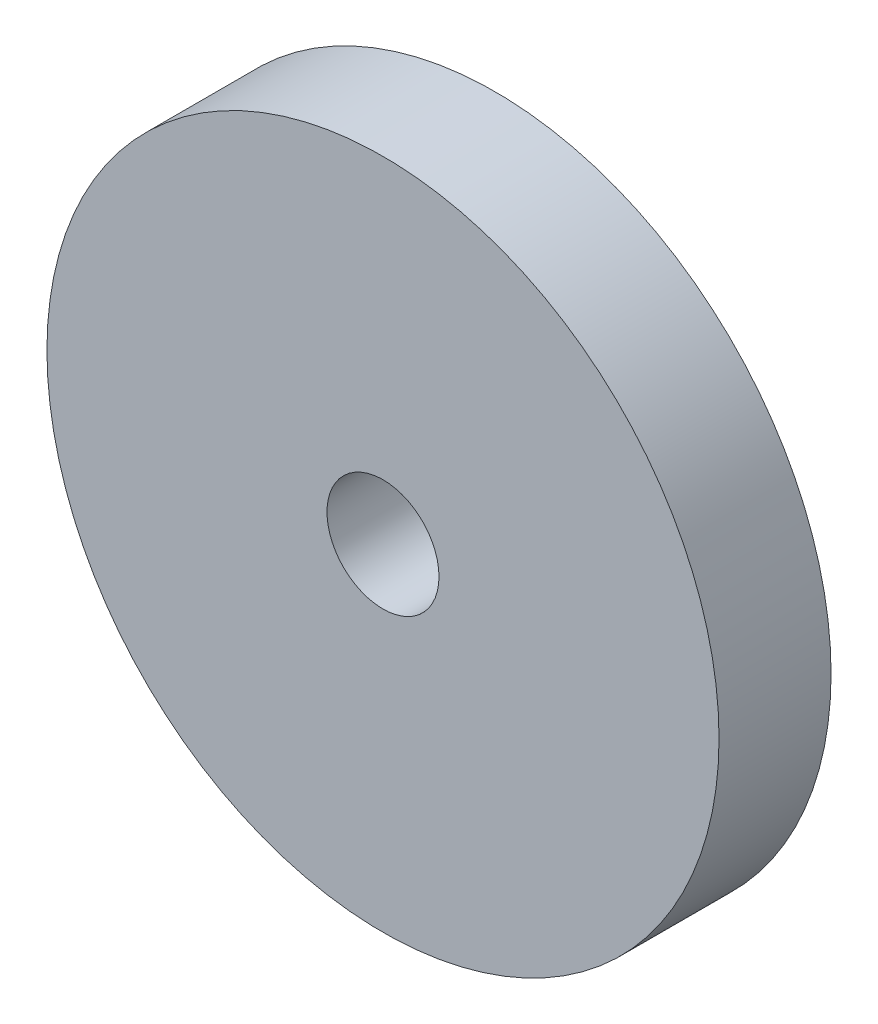
ISO-10303-21;
HEADER;
FILE_DESCRIPTION(('STEP AP214'),'2;1');
FILE_NAME('part.step','',(''),(''),'','','');
FILE_SCHEMA(('AUTOMOTIVE_DESIGN { 1 0 10303 214 1 1 1 1 }'));
ENDSEC;
DATA;
#1=APPLICATION_CONTEXT('core data for automotive mechanical design processes');
#2=APPLICATION_PROTOCOL_DEFINITION('international standard','automotive_design',2000,#1);
#3=PRODUCT_CONTEXT('',#1,'mechanical');
#4=PRODUCT('Part','Part','',(#3));
#5=PRODUCT_RELATED_PRODUCT_CATEGORY('part','',(#4));
#6=PRODUCT_DEFINITION_FORMATION('','',#4);
#7=PRODUCT_DEFINITION_CONTEXT('part definition',#1,'design');
#8=PRODUCT_DEFINITION('design','',#6,#7);
#9=PRODUCT_DEFINITION_SHAPE('','',#8);
#10=(LENGTH_UNIT() NAMED_UNIT(*) SI_UNIT(.MILLI.,.METRE.));
#11=(NAMED_UNIT(*) PLANE_ANGLE_UNIT() SI_UNIT($,.RADIAN.));
#12=(NAMED_UNIT(*) SI_UNIT($,.STERADIAN.) SOLID_ANGLE_UNIT());
#13=UNCERTAINTY_MEASURE_WITH_UNIT(LENGTH_MEASURE(1.E-05),#10,'distance_accuracy_value','');
#14=(GEOMETRIC_REPRESENTATION_CONTEXT(3) GLOBAL_UNCERTAINTY_ASSIGNED_CONTEXT((#13)) GLOBAL_UNIT_ASSIGNED_CONTEXT((#10,
#11,#12)) REPRESENTATION_CONTEXT('',''));
#15=CARTESIAN_POINT('',(0.,0.,0.));
#16=DIRECTION('',(0.,0.,1.));
#17=DIRECTION('',(1.,0.,0.));
#18=AXIS2_PLACEMENT_3D('',#15,#16,#17);
#19=CARTESIAN_POINT('',(18.5642751067,286.9748211934,3.));
#20=DIRECTION('',(0.,0.,1.));
#21=DIRECTION('',(1.,0.,0.));
#22=AXIS2_PLACEMENT_3D('',#19,#20,#21);
#23=PLANE('',#22);
#24=CARTESIAN_POINT('',(18.5642751067,286.9748211934,3.));
#25=DIRECTION('',(0.,0.,1.));
#26=DIRECTION('',(1.,0.,0.));
#27=AXIS2_PLACEMENT_3D('',#24,#25,#26);
#28=CIRCLE('',#27,9.00000000000001);
#29=CARTESIAN_POINT('',(27.5642751067,286.9748211934,3.));
#30=VERTEX_POINT('',#29);
#31=EDGE_CURVE('E10',#30,#30,#28,.T.);
#32=ORIENTED_EDGE('',*,*,#31,.T.);
#33=EDGE_LOOP('',(#32));
#34=FACE_BOUND('',#33,.T.);
#35=CARTESIAN_POINT('',(18.5642751067,286.9748211934,3.));
#36=DIRECTION('',(0.,0.,1.));
#37=DIRECTION('',(1.,0.,0.));
#38=AXIS2_PLACEMENT_3D('',#35,#36,#37);
#39=CIRCLE('',#38,1.5);
#40=CARTESIAN_POINT('',(20.0642751067,286.9748211934,3.));
#41=VERTEX_POINT('',#40);
#42=EDGE_CURVE('E42',#41,#41,#39,.T.);
#43=ORIENTED_EDGE('',*,*,#42,.F.);
#44=EDGE_LOOP('',(#43));
#45=FACE_BOUND('',#44,.T.);
#46=ADVANCED_FACE('F31',(#34,#45),#23,.T.);
#47=CARTESIAN_POINT('',(18.5642751067,286.9748211934,0.));
#48=DIRECTION('',(0.,0.,1.));
#49=DIRECTION('',(1.,0.,0.));
#50=AXIS2_PLACEMENT_3D('',#47,#48,#49);
#51=PLANE('',#50);
#52=CARTESIAN_POINT('',(18.5642751067,286.9748211934,0.));
#53=DIRECTION('',(0.,0.,1.));
#54=DIRECTION('',(1.,0.,0.));
#55=AXIS2_PLACEMENT_3D('',#52,#53,#54);
#56=CIRCLE('',#55,9.00000000000001);
#57=CARTESIAN_POINT('',(27.5642751067,286.9748211934,0.));
#58=VERTEX_POINT('',#57);
#59=EDGE_CURVE('E35',#58,#58,#56,.T.);
#60=ORIENTED_EDGE('',*,*,#59,.F.);
#61=EDGE_LOOP('',(#60));
#62=FACE_BOUND('',#61,.T.);
#63=CARTESIAN_POINT('',(18.5642751067,286.9748211934,0.));
#64=DIRECTION('',(0.,0.,1.));
#65=DIRECTION('',(1.,0.,0.));
#66=AXIS2_PLACEMENT_3D('',#63,#64,#65);
#67=CIRCLE('',#66,1.5);
#68=CARTESIAN_POINT('',(20.0642751067,286.9748211934,0.));
#69=VERTEX_POINT('',#68);
#70=EDGE_CURVE('E44',#69,#69,#67,.T.);
#71=ORIENTED_EDGE('',*,*,#70,.T.);
#72=EDGE_LOOP('',(#71));
#73=FACE_BOUND('',#72,.T.);
#74=ADVANCED_FACE('F54',(#62,#73),#51,.F.);
#75=CARTESIAN_POINT('',(18.5642751067,286.9748211934,3.));
#76=DIRECTION('',(0.,0.,-1.));
#77=DIRECTION('',(-1.,0.,0.));
#78=AXIS2_PLACEMENT_3D('',#75,#76,#77);
#79=CYLINDRICAL_SURFACE('',#78,9.00000000000001);
#80=ORIENTED_EDGE('',*,*,#31,.F.);
#81=EDGE_LOOP('',(#80));
#82=FACE_BOUND('',#81,.T.);
#83=ORIENTED_EDGE('',*,*,#59,.T.);
#84=EDGE_LOOP('',(#83));
#85=FACE_BOUND('',#84,.T.);
#86=ADVANCED_FACE('F33',(#82,#85),#79,.T.);
#87=CARTESIAN_POINT('',(18.5642751067,286.9748211934,3.));
#88=DIRECTION('',(0.,0.,-1.));
#89=DIRECTION('',(-1.,0.,0.));
#90=AXIS2_PLACEMENT_3D('',#87,#88,#89);
#91=CYLINDRICAL_SURFACE('',#90,1.5);
#92=ORIENTED_EDGE('',*,*,#42,.T.);
#93=EDGE_LOOP('',(#92));
#94=FACE_BOUND('',#93,.T.);
#95=ORIENTED_EDGE('',*,*,#70,.F.);
#96=EDGE_LOOP('',(#95));
#97=FACE_BOUND('',#96,.T.);
#98=ADVANCED_FACE('F50',(#94,#97),#91,.F.);
#99=CLOSED_SHELL('',(#46,#74,#86,#98));
#100=MANIFOLD_SOLID_BREP('B2',#99);
#101=ADVANCED_BREP_SHAPE_REPRESENTATION('',(#18,#100),#14);
#102=SHAPE_DEFINITION_REPRESENTATION(#9,#101);
ENDSEC;
END-ISO-10303-21;
